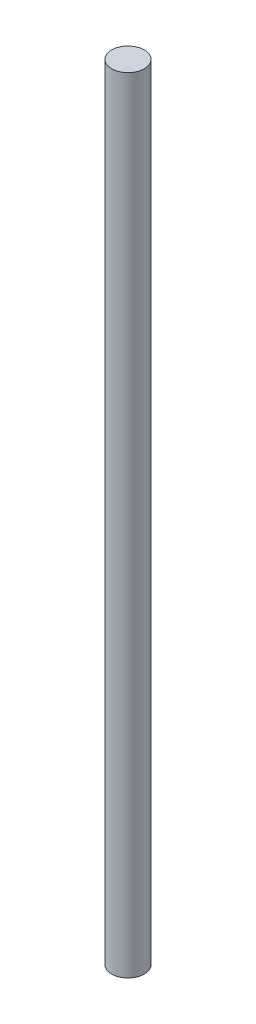
ISO-10303-21;
HEADER;
FILE_DESCRIPTION(('STEP AP214'),'2;1');
FILE_NAME('part.step','',(''),(''),'','','');
FILE_SCHEMA(('AUTOMOTIVE_DESIGN { 1 0 10303 214 1 1 1 1 }'));
ENDSEC;
DATA;
#1=APPLICATION_CONTEXT('core data for automotive mechanical design processes');
#2=APPLICATION_PROTOCOL_DEFINITION('international standard','automotive_design',2000,#1);
#3=PRODUCT_CONTEXT('',#1,'mechanical');
#4=PRODUCT('Part','Part','',(#3));
#5=PRODUCT_RELATED_PRODUCT_CATEGORY('part','',(#4));
#6=PRODUCT_DEFINITION_FORMATION('','',#4);
#7=PRODUCT_DEFINITION_CONTEXT('part definition',#1,'design');
#8=PRODUCT_DEFINITION('design','',#6,#7);
#9=PRODUCT_DEFINITION_SHAPE('','',#8);
#10=(LENGTH_UNIT() NAMED_UNIT(*) SI_UNIT(.MILLI.,.METRE.));
#11=(NAMED_UNIT(*) PLANE_ANGLE_UNIT() SI_UNIT($,.RADIAN.));
#12=(NAMED_UNIT(*) SI_UNIT($,.STERADIAN.) SOLID_ANGLE_UNIT());
#13=UNCERTAINTY_MEASURE_WITH_UNIT(LENGTH_MEASURE(1.E-05),#10,'distance_accuracy_value','');
#14=(GEOMETRIC_REPRESENTATION_CONTEXT(3) GLOBAL_UNCERTAINTY_ASSIGNED_CONTEXT((#13)) GLOBAL_UNIT_ASSIGNED_CONTEXT((#10,
#11,#12)) REPRESENTATION_CONTEXT('',''));
#15=CARTESIAN_POINT('',(0.,0.,0.));
#16=DIRECTION('',(0.,0.,1.));
#17=DIRECTION('',(1.,0.,0.));
#18=AXIS2_PLACEMENT_3D('',#15,#16,#17);
#19=CARTESIAN_POINT('',(0.,457.2,0.));
#20=DIRECTION('',(0.,-1.,0.));
#21=DIRECTION('',(0.,0.,-1.));
#22=AXIS2_PLACEMENT_3D('',#19,#20,#21);
#23=CYLINDRICAL_SURFACE('',#22,9.525);
#24=CARTESIAN_POINT('',(0.,457.2,0.));
#25=DIRECTION('',(0.,1.,0.));
#26=DIRECTION('',(0.,0.,1.));
#27=AXIS2_PLACEMENT_3D('',#24,#25,#26);
#28=CIRCLE('',#27,9.525);
#29=CARTESIAN_POINT('',(0.,457.2,9.525));
#30=VERTEX_POINT('',#29);
#31=EDGE_CURVE('E10',#30,#30,#28,.T.);
#32=ORIENTED_EDGE('',*,*,#31,.F.);
#33=EDGE_LOOP('',(#32));
#34=FACE_BOUND('',#33,.T.);
#35=CARTESIAN_POINT('',(0.,0.,0.));
#36=DIRECTION('',(0.,1.,0.));
#37=DIRECTION('',(0.,0.,1.));
#38=AXIS2_PLACEMENT_3D('',#35,#36,#37);
#39=CIRCLE('',#38,9.525);
#40=CARTESIAN_POINT('',(0.,0.,9.525));
#41=VERTEX_POINT('',#40);
#42=EDGE_CURVE('E35',#41,#41,#39,.T.);
#43=ORIENTED_EDGE('',*,*,#42,.T.);
#44=EDGE_LOOP('',(#43));
#45=FACE_BOUND('',#44,.T.);
#46=ADVANCED_FACE('F32',(#34,#45),#23,.T.);
#47=CARTESIAN_POINT('',(0.,457.2,0.));
#48=DIRECTION('',(0.,1.,0.));
#49=DIRECTION('',(0.,0.,1.));
#50=AXIS2_PLACEMENT_3D('',#47,#48,#49);
#51=PLANE('',#50);
#52=ORIENTED_EDGE('',*,*,#31,.T.);
#53=EDGE_LOOP('',(#52));
#54=FACE_BOUND('',#53,.T.);
#55=ADVANCED_FACE('F47',(#54),#51,.T.);
#56=CARTESIAN_POINT('',(0.,0.,0.));
#57=DIRECTION('',(0.,1.,0.));
#58=DIRECTION('',(0.,0.,1.));
#59=AXIS2_PLACEMENT_3D('',#56,#57,#58);
#60=PLANE('',#59);
#61=ORIENTED_EDGE('',*,*,#42,.F.);
#62=EDGE_LOOP('',(#61));
#63=FACE_BOUND('',#62,.T.);
#64=ADVANCED_FACE('F45',(#63),#60,.F.);
#65=CLOSED_SHELL('',(#46,#55,#64));
#66=MANIFOLD_SOLID_BREP('B2',#65);
#67=ADVANCED_BREP_SHAPE_REPRESENTATION('',(#18,#66),#14);
#68=SHAPE_DEFINITION_REPRESENTATION(#9,#67);
ENDSEC;
END-ISO-10303-21;
